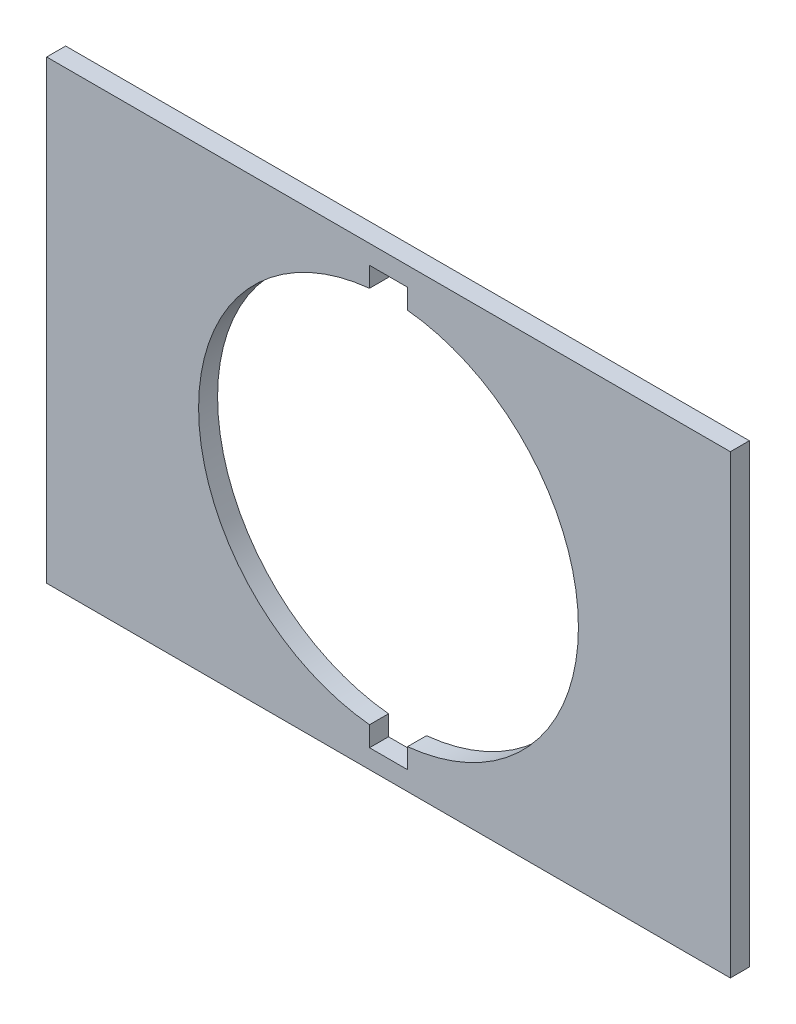
ISO-10303-21;
HEADER;
FILE_DESCRIPTION(('STEP AP214'),'2;1');
FILE_NAME('part.step','',(''),(''),'','','');
FILE_SCHEMA(('AUTOMOTIVE_DESIGN { 1 0 10303 214 1 1 1 1 }'));
ENDSEC;
DATA;
#1=APPLICATION_CONTEXT('core data for automotive mechanical design processes');
#2=APPLICATION_PROTOCOL_DEFINITION('international standard','automotive_design',2000,#1);
#3=PRODUCT_CONTEXT('',#1,'mechanical');
#4=PRODUCT('Part','Part','',(#3));
#5=PRODUCT_RELATED_PRODUCT_CATEGORY('part','',(#4));
#6=PRODUCT_DEFINITION_FORMATION('','',#4);
#7=PRODUCT_DEFINITION_CONTEXT('part definition',#1,'design');
#8=PRODUCT_DEFINITION('design','',#6,#7);
#9=PRODUCT_DEFINITION_SHAPE('','',#8);
#10=(LENGTH_UNIT() NAMED_UNIT(*) SI_UNIT(.MILLI.,.METRE.));
#11=(NAMED_UNIT(*) PLANE_ANGLE_UNIT() SI_UNIT($,.RADIAN.));
#12=(NAMED_UNIT(*) SI_UNIT($,.STERADIAN.) SOLID_ANGLE_UNIT());
#13=UNCERTAINTY_MEASURE_WITH_UNIT(LENGTH_MEASURE(1.E-05),#10,'distance_accuracy_value','');
#14=(GEOMETRIC_REPRESENTATION_CONTEXT(3) GLOBAL_UNCERTAINTY_ASSIGNED_CONTEXT((#13)) GLOBAL_UNIT_ASSIGNED_CONTEXT((#10,
#11,#12)) REPRESENTATION_CONTEXT('',''));
#15=CARTESIAN_POINT('',(0.,0.,0.));
#16=DIRECTION('',(0.,0.,1.));
#17=DIRECTION('',(1.,0.,0.));
#18=AXIS2_PLACEMENT_3D('',#15,#16,#17);
#19=CARTESIAN_POINT('',(0.,0.,12.7));
#20=DIRECTION('',(0.,0.,-1.));
#21=DIRECTION('',(-1.,0.,0.));
#22=AXIS2_PLACEMENT_3D('',#19,#20,#21);
#23=PLANE('',#22);
#24=DIRECTION('',(0.,-1.,0.));
#25=VECTOR('',#24,1.);
#26=CARTESIAN_POINT('',(-228.6,152.4,12.7));
#27=LINE('',#26,#25);
#28=CARTESIAN_POINT('',(-228.6,152.4,12.7));
#29=VERTEX_POINT('',#28);
#30=CARTESIAN_POINT('',(-228.6,-152.4,12.7));
#31=VERTEX_POINT('',#30);
#32=EDGE_CURVE('E187',#29,#31,#27,.T.);
#33=ORIENTED_EDGE('',*,*,#32,.T.);
#34=DIRECTION('',(1.,0.,0.));
#35=VECTOR('',#34,1.);
#36=CARTESIAN_POINT('',(228.6,-152.4,12.7));
#37=LINE('',#36,#35);
#38=CARTESIAN_POINT('',(228.6,-152.4,12.7));
#39=VERTEX_POINT('',#38);
#40=EDGE_CURVE('E190',#31,#39,#37,.T.);
#41=ORIENTED_EDGE('',*,*,#40,.T.);
#42=DIRECTION('',(0.,1.,0.));
#43=VECTOR('',#42,1.);
#44=CARTESIAN_POINT('',(228.6,152.4,12.7));
#45=LINE('',#44,#43);
#46=CARTESIAN_POINT('',(228.6,152.4,12.7));
#47=VERTEX_POINT('',#46);
#48=EDGE_CURVE('E193',#39,#47,#45,.T.);
#49=ORIENTED_EDGE('',*,*,#48,.T.);
#50=DIRECTION('',(-1.,0.,0.));
#51=VECTOR('',#50,1.);
#52=CARTESIAN_POINT('',(228.6,152.4,12.7));
#53=LINE('',#52,#51);
#54=EDGE_CURVE('E195',#47,#29,#53,.T.);
#55=ORIENTED_EDGE('',*,*,#54,.T.);
#56=EDGE_LOOP('',(#33,#41,#49,#55));
#57=FACE_BOUND('',#56,.T.);
#58=DIRECTION('',(0.,1.,0.));
#59=VECTOR('',#58,1.);
#60=CARTESIAN_POINT('',(12.7,0.,12.7));
#61=LINE('',#60,#59);
#62=CARTESIAN_POINT('',(12.7,-139.7,12.7));
#63=VERTEX_POINT('',#62);
#64=CARTESIAN_POINT('',(12.7,-126.363404512541,12.7));
#65=VERTEX_POINT('',#64);
#66=EDGE_CURVE('E141',#63,#65,#61,.T.);
#67=ORIENTED_EDGE('',*,*,#66,.F.);
#68=DIRECTION('',(1.,0.,0.));
#69=VECTOR('',#68,1.);
#70=CARTESIAN_POINT('',(0.,-139.7,12.7));
#71=LINE('',#70,#69);
#72=CARTESIAN_POINT('',(-12.7,-139.7,12.7));
#73=VERTEX_POINT('',#72);
#74=EDGE_CURVE('E126',#73,#63,#71,.T.);
#75=ORIENTED_EDGE('',*,*,#74,.F.);
#76=DIRECTION('',(0.,1.,0.));
#77=VECTOR('',#76,1.);
#78=CARTESIAN_POINT('',(-12.7,0.,12.7));
#79=LINE('',#78,#77);
#80=CARTESIAN_POINT('',(-12.7,-126.363404512541,12.7));
#81=VERTEX_POINT('',#80);
#82=EDGE_CURVE('E132',#73,#81,#79,.T.);
#83=ORIENTED_EDGE('',*,*,#82,.T.);
#84=CARTESIAN_POINT('',(0.,0.,12.7));
#85=DIRECTION('',(0.,0.,1.));
#86=DIRECTION('',(1.,0.,0.));
#87=AXIS2_PLACEMENT_3D('',#84,#85,#86);
#88=CIRCLE('',#87,127.);
#89=CARTESIAN_POINT('',(-12.7,126.363404512541,12.7));
#90=VERTEX_POINT('',#89);
#91=EDGE_CURVE('E180',#90,#81,#88,.T.);
#92=ORIENTED_EDGE('',*,*,#91,.F.);
#93=DIRECTION('',(0.,-1.,0.));
#94=VECTOR('',#93,1.);
#95=CARTESIAN_POINT('',(-12.7,0.,12.7));
#96=LINE('',#95,#94);
#97=CARTESIAN_POINT('',(-12.7,139.7,12.7));
#98=VERTEX_POINT('',#97);
#99=EDGE_CURVE('E56',#98,#90,#96,.T.);
#100=ORIENTED_EDGE('',*,*,#99,.F.);
#101=DIRECTION('',(1.,0.,0.));
#102=VECTOR('',#101,1.);
#103=CARTESIAN_POINT('',(0.,139.7,12.7));
#104=LINE('',#103,#102);
#105=CARTESIAN_POINT('',(12.7,139.7,12.7));
#106=VERTEX_POINT('',#105);
#107=EDGE_CURVE('E167',#98,#106,#104,.T.);
#108=ORIENTED_EDGE('',*,*,#107,.T.);
#109=DIRECTION('',(0.,-1.,0.));
#110=VECTOR('',#109,1.);
#111=CARTESIAN_POINT('',(12.7,0.,12.7));
#112=LINE('',#111,#110);
#113=CARTESIAN_POINT('',(12.7,126.363404512541,12.7));
#114=VERTEX_POINT('',#113);
#115=EDGE_CURVE('E155',#106,#114,#112,.T.);
#116=ORIENTED_EDGE('',*,*,#115,.T.);
#117=EDGE_CURVE('E183',#65,#114,#88,.T.);
#118=ORIENTED_EDGE('',*,*,#117,.F.);
#119=EDGE_LOOP('',(#67,#75,#83,#92,#100,#108,#116,#118));
#120=FACE_BOUND('',#119,.T.);
#121=ADVANCED_FACE('F33',(#57,#120),#23,.F.);
#122=CARTESIAN_POINT('',(0.,0.,0.));
#123=DIRECTION('',(0.,0.,-1.));
#124=DIRECTION('',(-1.,0.,0.));
#125=AXIS2_PLACEMENT_3D('',#122,#123,#124);
#126=PLANE('',#125);
#127=DIRECTION('',(0.,-1.,0.));
#128=VECTOR('',#127,1.);
#129=CARTESIAN_POINT('',(-228.6,152.4,0.));
#130=LINE('',#129,#128);
#131=CARTESIAN_POINT('',(-228.6,152.4,0.));
#132=VERTEX_POINT('',#131);
#133=CARTESIAN_POINT('',(-228.6,-152.4,0.));
#134=VERTEX_POINT('',#133);
#135=EDGE_CURVE('E182',#132,#134,#130,.T.);
#136=ORIENTED_EDGE('',*,*,#135,.F.);
#137=DIRECTION('',(-1.,0.,0.));
#138=VECTOR('',#137,1.);
#139=CARTESIAN_POINT('',(228.6,152.4,0.));
#140=LINE('',#139,#138);
#141=CARTESIAN_POINT('',(228.6,152.4,0.));
#142=VERTEX_POINT('',#141);
#143=EDGE_CURVE('E191',#142,#132,#140,.T.);
#144=ORIENTED_EDGE('',*,*,#143,.F.);
#145=DIRECTION('',(0.,1.,0.));
#146=VECTOR('',#145,1.);
#147=CARTESIAN_POINT('',(228.6,152.4,0.));
#148=LINE('',#147,#146);
#149=CARTESIAN_POINT('',(228.6,-152.4,0.));
#150=VERTEX_POINT('',#149);
#151=EDGE_CURVE('E202',#150,#142,#148,.T.);
#152=ORIENTED_EDGE('',*,*,#151,.F.);
#153=DIRECTION('',(1.,0.,0.));
#154=VECTOR('',#153,1.);
#155=CARTESIAN_POINT('',(228.6,-152.4,0.));
#156=LINE('',#155,#154);
#157=EDGE_CURVE('E200',#134,#150,#156,.T.);
#158=ORIENTED_EDGE('',*,*,#157,.F.);
#159=EDGE_LOOP('',(#136,#144,#152,#158));
#160=FACE_BOUND('',#159,.T.);
#161=DIRECTION('',(1.,0.,0.));
#162=VECTOR('',#161,1.);
#163=CARTESIAN_POINT('',(0.,-139.7,0.));
#164=LINE('',#163,#162);
#165=CARTESIAN_POINT('',(-12.7,-139.7,0.));
#166=VERTEX_POINT('',#165);
#167=CARTESIAN_POINT('',(12.7,-139.7,0.));
#168=VERTEX_POINT('',#167);
#169=EDGE_CURVE('E129',#166,#168,#164,.T.);
#170=ORIENTED_EDGE('',*,*,#169,.T.);
#171=DIRECTION('',(0.,1.,0.));
#172=VECTOR('',#171,1.);
#173=CARTESIAN_POINT('',(12.7,0.,0.));
#174=LINE('',#173,#172);
#175=CARTESIAN_POINT('',(12.7,-126.363404512541,0.));
#176=VERTEX_POINT('',#175);
#177=EDGE_CURVE('E149',#168,#176,#174,.T.);
#178=ORIENTED_EDGE('',*,*,#177,.T.);
#179=CARTESIAN_POINT('',(0.,0.,0.));
#180=DIRECTION('',(0.,0.,1.));
#181=DIRECTION('',(1.,0.,0.));
#182=AXIS2_PLACEMENT_3D('',#179,#180,#181);
#183=CIRCLE('',#182,127.);
#184=CARTESIAN_POINT('',(12.7,126.363404512541,0.));
#185=VERTEX_POINT('',#184);
#186=EDGE_CURVE('E174',#176,#185,#183,.T.);
#187=ORIENTED_EDGE('',*,*,#186,.T.);
#188=DIRECTION('',(0.,-1.,0.));
#189=VECTOR('',#188,1.);
#190=CARTESIAN_POINT('',(12.7,0.,0.));
#191=LINE('',#190,#189);
#192=CARTESIAN_POINT('',(12.7,139.7,0.));
#193=VERTEX_POINT('',#192);
#194=EDGE_CURVE('E156',#193,#185,#191,.T.);
#195=ORIENTED_EDGE('',*,*,#194,.F.);
#196=DIRECTION('',(1.,0.,0.));
#197=VECTOR('',#196,1.);
#198=CARTESIAN_POINT('',(0.,139.7,0.));
#199=LINE('',#198,#197);
#200=CARTESIAN_POINT('',(-12.7,139.7,0.));
#201=VERTEX_POINT('',#200);
#202=EDGE_CURVE('E159',#201,#193,#199,.T.);
#203=ORIENTED_EDGE('',*,*,#202,.F.);
#204=DIRECTION('',(0.,-1.,0.));
#205=VECTOR('',#204,1.);
#206=CARTESIAN_POINT('',(-12.7,0.,0.));
#207=LINE('',#206,#205);
#208=CARTESIAN_POINT('',(-12.7,126.363404512541,0.));
#209=VERTEX_POINT('',#208);
#210=EDGE_CURVE('E161',#201,#209,#207,.T.);
#211=ORIENTED_EDGE('',*,*,#210,.T.);
#212=CARTESIAN_POINT('',(-12.7,-126.363404512541,0.));
#213=VERTEX_POINT('',#212);
#214=EDGE_CURVE('E184',#209,#213,#183,.T.);
#215=ORIENTED_EDGE('',*,*,#214,.T.);
#216=DIRECTION('',(0.,1.,0.));
#217=VECTOR('',#216,1.);
#218=CARTESIAN_POINT('',(-12.7,0.,0.));
#219=LINE('',#218,#217);
#220=EDGE_CURVE('E48',#166,#213,#219,.T.);
#221=ORIENTED_EDGE('',*,*,#220,.F.);
#222=EDGE_LOOP('',(#170,#178,#187,#195,#203,#211,#215,#221));
#223=FACE_BOUND('',#222,.T.);
#224=ADVANCED_FACE('F220',(#160,#223),#126,.T.);
#225=CARTESIAN_POINT('',(0.,0.,12.7));
#226=DIRECTION('',(0.,0.,-1.));
#227=DIRECTION('',(-1.,0.,0.));
#228=AXIS2_PLACEMENT_3D('',#225,#226,#227);
#229=CYLINDRICAL_SURFACE('',#228,127.);
#230=ORIENTED_EDGE('',*,*,#186,.F.);
#231=DIRECTION('',(0.,0.,1.));
#232=VECTOR('',#231,1.);
#233=CARTESIAN_POINT('',(12.7,-126.363404512541,0.));
#234=LINE('',#233,#232);
#235=EDGE_CURVE('E152',#176,#65,#234,.T.);
#236=ORIENTED_EDGE('',*,*,#235,.T.);
#237=ORIENTED_EDGE('',*,*,#117,.T.);
#238=DIRECTION('',(0.,0.,1.));
#239=VECTOR('',#238,1.);
#240=CARTESIAN_POINT('',(12.7,126.363404512541,0.));
#241=LINE('',#240,#239);
#242=EDGE_CURVE('E171',#185,#114,#241,.T.);
#243=ORIENTED_EDGE('',*,*,#242,.F.);
#244=EDGE_LOOP('',(#230,#236,#237,#243));
#245=FACE_BOUND('',#244,.T.);
#246=ADVANCED_FACE('F243',(#245),#229,.F.);
#247=DIRECTION('',(0.,0.,1.));
#248=VECTOR('',#247,1.);
#249=CARTESIAN_POINT('',(-12.7,-126.363404512541,0.));
#250=LINE('',#249,#248);
#251=EDGE_CURVE('E134',#213,#81,#250,.T.);
#252=ORIENTED_EDGE('',*,*,#251,.F.);
#253=ORIENTED_EDGE('',*,*,#214,.F.);
#254=DIRECTION('',(0.,0.,1.));
#255=VECTOR('',#254,1.);
#256=CARTESIAN_POINT('',(-12.7,126.363404512541,0.));
#257=LINE('',#256,#255);
#258=EDGE_CURVE('E175',#209,#90,#257,.T.);
#259=ORIENTED_EDGE('',*,*,#258,.T.);
#260=ORIENTED_EDGE('',*,*,#91,.T.);
#261=EDGE_LOOP('',(#252,#253,#259,#260));
#262=FACE_BOUND('',#261,.T.);
#263=ADVANCED_FACE('F237',(#262),#229,.F.);
#264=CARTESIAN_POINT('',(-228.6,152.4,12.7));
#265=DIRECTION('',(1.,0.,0.));
#266=DIRECTION('',(0.,1.,0.));
#267=AXIS2_PLACEMENT_3D('',#264,#265,#266);
#268=PLANE('',#267);
#269=ORIENTED_EDGE('',*,*,#135,.T.);
#270=DIRECTION('',(0.,0.,-1.));
#271=VECTOR('',#270,1.);
#272=CARTESIAN_POINT('',(-228.6,-152.4,12.7));
#273=LINE('',#272,#271);
#274=EDGE_CURVE('E11',#31,#134,#273,.T.);
#275=ORIENTED_EDGE('',*,*,#274,.F.);
#276=ORIENTED_EDGE('',*,*,#32,.F.);
#277=DIRECTION('',(0.,0.,-1.));
#278=VECTOR('',#277,1.);
#279=CARTESIAN_POINT('',(-228.6,152.4,12.7));
#280=LINE('',#279,#278);
#281=EDGE_CURVE('E197',#29,#132,#280,.T.);
#282=ORIENTED_EDGE('',*,*,#281,.T.);
#283=EDGE_LOOP('',(#269,#275,#276,#282));
#284=FACE_BOUND('',#283,.T.);
#285=ADVANCED_FACE('F35',(#284),#268,.F.);
#286=CARTESIAN_POINT('',(228.6,-152.4,12.7));
#287=DIRECTION('',(0.,1.,0.));
#288=DIRECTION('',(-1.,0.,0.));
#289=AXIS2_PLACEMENT_3D('',#286,#287,#288);
#290=PLANE('',#289);
#291=ORIENTED_EDGE('',*,*,#157,.T.);
#292=DIRECTION('',(0.,0.,-1.));
#293=VECTOR('',#292,1.);
#294=CARTESIAN_POINT('',(228.6,-152.4,12.7));
#295=LINE('',#294,#293);
#296=EDGE_CURVE('E41',#39,#150,#295,.T.);
#297=ORIENTED_EDGE('',*,*,#296,.F.);
#298=ORIENTED_EDGE('',*,*,#40,.F.);
#299=ORIENTED_EDGE('',*,*,#274,.T.);
#300=EDGE_LOOP('',(#291,#297,#298,#299));
#301=FACE_BOUND('',#300,.T.);
#302=ADVANCED_FACE('F230',(#301),#290,.F.);
#303=CARTESIAN_POINT('',(228.6,152.4,12.7));
#304=DIRECTION('',(-1.,0.,0.));
#305=DIRECTION('',(0.,-1.,0.));
#306=AXIS2_PLACEMENT_3D('',#303,#304,#305);
#307=PLANE('',#306);
#308=ORIENTED_EDGE('',*,*,#151,.T.);
#309=DIRECTION('',(0.,0.,-1.));
#310=VECTOR('',#309,1.);
#311=CARTESIAN_POINT('',(228.6,152.4,12.7));
#312=LINE('',#311,#310);
#313=EDGE_CURVE('E207',#47,#142,#312,.T.);
#314=ORIENTED_EDGE('',*,*,#313,.F.);
#315=ORIENTED_EDGE('',*,*,#48,.F.);
#316=ORIENTED_EDGE('',*,*,#296,.T.);
#317=EDGE_LOOP('',(#308,#314,#315,#316));
#318=FACE_BOUND('',#317,.T.);
#319=ADVANCED_FACE('F214',(#318),#307,.F.);
#320=CARTESIAN_POINT('',(228.6,152.4,12.7));
#321=DIRECTION('',(0.,-1.,0.));
#322=DIRECTION('',(1.,0.,0.));
#323=AXIS2_PLACEMENT_3D('',#320,#321,#322);
#324=PLANE('',#323);
#325=ORIENTED_EDGE('',*,*,#143,.T.);
#326=ORIENTED_EDGE('',*,*,#281,.F.);
#327=ORIENTED_EDGE('',*,*,#54,.F.);
#328=ORIENTED_EDGE('',*,*,#313,.T.);
#329=EDGE_LOOP('',(#325,#326,#327,#328));
#330=FACE_BOUND('',#329,.T.);
#331=ADVANCED_FACE('F224',(#330),#324,.F.);
#332=CARTESIAN_POINT('',(12.7,0.,0.));
#333=DIRECTION('',(-1.,0.,0.));
#334=DIRECTION('',(0.,-1.,0.));
#335=AXIS2_PLACEMENT_3D('',#332,#333,#334);
#336=PLANE('',#335);
#337=ORIENTED_EDGE('',*,*,#115,.F.);
#338=DIRECTION('',(0.,0.,1.));
#339=VECTOR('',#338,1.);
#340=CARTESIAN_POINT('',(12.7,139.7,0.));
#341=LINE('',#340,#339);
#342=EDGE_CURVE('E164',#193,#106,#341,.T.);
#343=ORIENTED_EDGE('',*,*,#342,.F.);
#344=ORIENTED_EDGE('',*,*,#194,.T.);
#345=ORIENTED_EDGE('',*,*,#242,.T.);
#346=EDGE_LOOP('',(#337,#343,#344,#345));
#347=FACE_BOUND('',#346,.T.);
#348=ADVANCED_FACE('F249',(#347),#336,.T.);
#349=CARTESIAN_POINT('',(-12.7,0.,0.));
#350=DIRECTION('',(-1.,0.,0.));
#351=DIRECTION('',(0.,0.,1.));
#352=AXIS2_PLACEMENT_3D('',#349,#350,#351);
#353=PLANE('',#352);
#354=ORIENTED_EDGE('',*,*,#99,.T.);
#355=ORIENTED_EDGE('',*,*,#258,.F.);
#356=ORIENTED_EDGE('',*,*,#210,.F.);
#357=DIRECTION('',(0.,0.,1.));
#358=VECTOR('',#357,1.);
#359=CARTESIAN_POINT('',(-12.7,139.7,0.));
#360=LINE('',#359,#358);
#361=EDGE_CURVE('E177',#201,#98,#360,.T.);
#362=ORIENTED_EDGE('',*,*,#361,.T.);
#363=EDGE_LOOP('',(#354,#355,#356,#362));
#364=FACE_BOUND('',#363,.T.);
#365=ADVANCED_FACE('F253',(#364),#353,.F.);
#366=CARTESIAN_POINT('',(0.,139.7,0.));
#367=DIRECTION('',(0.,-1.,0.));
#368=DIRECTION('',(0.,0.,-1.));
#369=AXIS2_PLACEMENT_3D('',#366,#367,#368);
#370=PLANE('',#369);
#371=ORIENTED_EDGE('',*,*,#107,.F.);
#372=ORIENTED_EDGE('',*,*,#361,.F.);
#373=ORIENTED_EDGE('',*,*,#202,.T.);
#374=ORIENTED_EDGE('',*,*,#342,.T.);
#375=EDGE_LOOP('',(#371,#372,#373,#374));
#376=FACE_BOUND('',#375,.T.);
#377=ADVANCED_FACE('F258',(#376),#370,.T.);
#378=CARTESIAN_POINT('',(12.7,0.,0.));
#379=DIRECTION('',(-1.,0.,0.));
#380=DIRECTION('',(0.,1.,0.));
#381=AXIS2_PLACEMENT_3D('',#378,#379,#380);
#382=PLANE('',#381);
#383=ORIENTED_EDGE('',*,*,#66,.T.);
#384=ORIENTED_EDGE('',*,*,#235,.F.);
#385=ORIENTED_EDGE('',*,*,#177,.F.);
#386=DIRECTION('',(0.,0.,1.));
#387=VECTOR('',#386,1.);
#388=CARTESIAN_POINT('',(12.7,-139.7,0.));
#389=LINE('',#388,#387);
#390=EDGE_CURVE('E138',#168,#63,#389,.T.);
#391=ORIENTED_EDGE('',*,*,#390,.T.);
#392=EDGE_LOOP('',(#383,#384,#385,#391));
#393=FACE_BOUND('',#392,.T.);
#394=ADVANCED_FACE('F263',(#393),#382,.T.);
#395=CARTESIAN_POINT('',(-12.7,0.,0.));
#396=DIRECTION('',(-1.,0.,0.));
#397=DIRECTION('',(0.,0.,1.));
#398=AXIS2_PLACEMENT_3D('',#395,#396,#397);
#399=PLANE('',#398);
#400=ORIENTED_EDGE('',*,*,#82,.F.);
#401=DIRECTION('',(0.,0.,1.));
#402=VECTOR('',#401,1.);
#403=CARTESIAN_POINT('',(-12.7,-139.7,0.));
#404=LINE('',#403,#402);
#405=EDGE_CURVE('E122',#166,#73,#404,.T.);
#406=ORIENTED_EDGE('',*,*,#405,.F.);
#407=ORIENTED_EDGE('',*,*,#220,.T.);
#408=ORIENTED_EDGE('',*,*,#251,.T.);
#409=EDGE_LOOP('',(#400,#406,#407,#408));
#410=FACE_BOUND('',#409,.T.);
#411=ADVANCED_FACE('F133',(#410),#399,.F.);
#412=CARTESIAN_POINT('',(0.,-139.7,0.));
#413=DIRECTION('',(0.,1.,0.));
#414=DIRECTION('',(0.,0.,-1.));
#415=AXIS2_PLACEMENT_3D('',#412,#413,#414);
#416=PLANE('',#415);
#417=ORIENTED_EDGE('',*,*,#74,.T.);
#418=ORIENTED_EDGE('',*,*,#390,.F.);
#419=ORIENTED_EDGE('',*,*,#169,.F.);
#420=ORIENTED_EDGE('',*,*,#405,.T.);
#421=EDGE_LOOP('',(#417,#418,#419,#420));
#422=FACE_BOUND('',#421,.T.);
#423=ADVANCED_FACE('F124',(#422),#416,.T.);
#424=CLOSED_SHELL('',(#121,#224,#246,#263,#285,#302,#319,#331,#348,#365,#377,#394,#411,#423));
#425=MANIFOLD_SOLID_BREP('B2',#424);
#426=ADVANCED_BREP_SHAPE_REPRESENTATION('',(#18,#425),#14);
#427=SHAPE_DEFINITION_REPRESENTATION(#9,#426);
ENDSEC;
END-ISO-10303-21;
